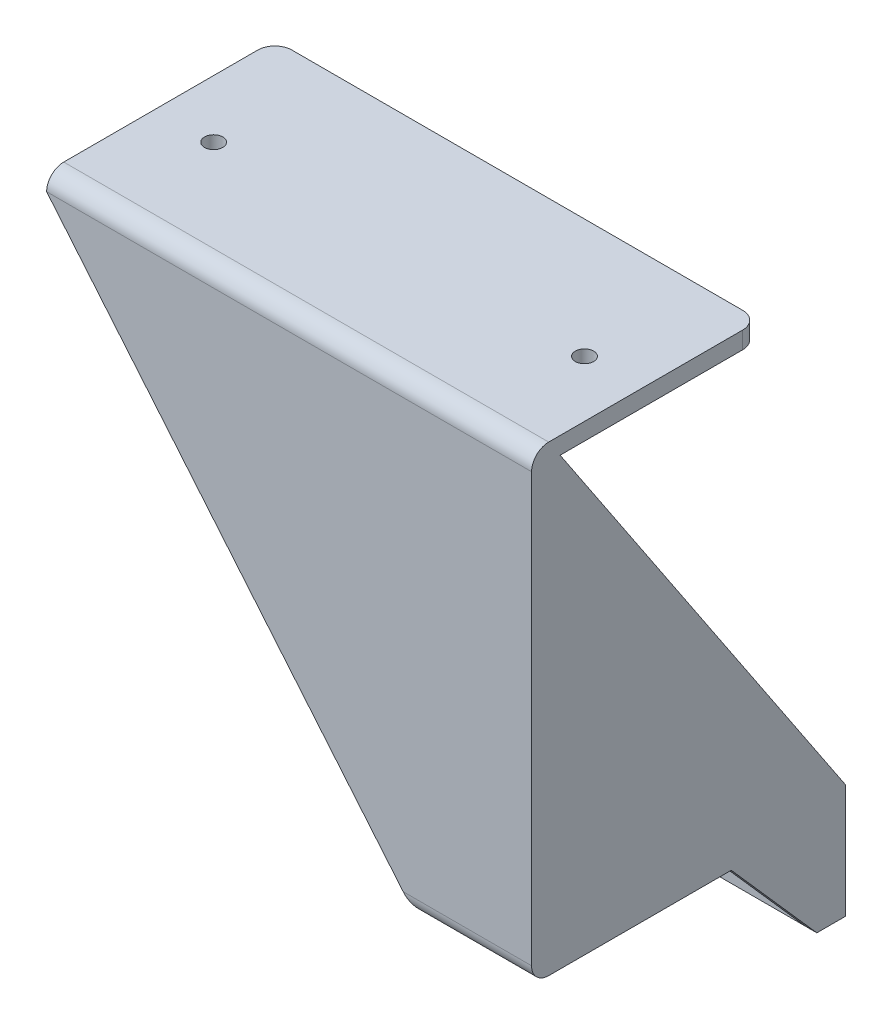
ISO-10303-21;
HEADER;
FILE_DESCRIPTION(('STEP AP214'),'2;1');
FILE_NAME('part.step','',(''),(''),'','','');
FILE_SCHEMA(('AUTOMOTIVE_DESIGN { 1 0 10303 214 1 1 1 1 }'));
ENDSEC;
DATA;
#1=APPLICATION_CONTEXT('core data for automotive mechanical design processes');
#2=APPLICATION_PROTOCOL_DEFINITION('international standard','automotive_design',2000,#1);
#3=PRODUCT_CONTEXT('',#1,'mechanical');
#4=PRODUCT('Part','Part','',(#3));
#5=PRODUCT_RELATED_PRODUCT_CATEGORY('part','',(#4));
#6=PRODUCT_DEFINITION_FORMATION('','',#4);
#7=PRODUCT_DEFINITION_CONTEXT('part definition',#1,'design');
#8=PRODUCT_DEFINITION('design','',#6,#7);
#9=PRODUCT_DEFINITION_SHAPE('','',#8);
#10=(LENGTH_UNIT() NAMED_UNIT(*) SI_UNIT(.MILLI.,.METRE.));
#11=(NAMED_UNIT(*) PLANE_ANGLE_UNIT() SI_UNIT($,.RADIAN.));
#12=(NAMED_UNIT(*) SI_UNIT($,.STERADIAN.) SOLID_ANGLE_UNIT());
#13=UNCERTAINTY_MEASURE_WITH_UNIT(LENGTH_MEASURE(1.E-05),#10,'distance_accuracy_value','');
#14=(GEOMETRIC_REPRESENTATION_CONTEXT(3) GLOBAL_UNCERTAINTY_ASSIGNED_CONTEXT((#13)) GLOBAL_UNIT_ASSIGNED_CONTEXT((#10,
#11,#12)) REPRESENTATION_CONTEXT('',''));
#15=CARTESIAN_POINT('',(0.,0.,0.));
#16=DIRECTION('',(0.,0.,1.));
#17=DIRECTION('',(1.,0.,0.));
#18=AXIS2_PLACEMENT_3D('',#15,#16,#17);
#19=CARTESIAN_POINT('',(-10.,-10.,5.));
#20=DIRECTION('',(1.,0.,0.));
#21=DIRECTION('',(0.,0.,-1.));
#22=AXIS2_PLACEMENT_3D('',#19,#20,#21);
#23=PLANE('',#22);
#24=DIRECTION('',(0.,0.,-1.));
#25=VECTOR('',#24,1.);
#26=CARTESIAN_POINT('',(-10.,7.,25.));
#27=LINE('',#26,#25);
#28=CARTESIAN_POINT('',(-10.,7.,52.));
#29=VERTEX_POINT('',#28);
#30=CARTESIAN_POINT('',(-10.,7.,20.));
#31=VERTEX_POINT('',#30);
#32=EDGE_CURVE('E271',#29,#31,#27,.T.);
#33=ORIENTED_EDGE('',*,*,#32,.F.);
#34=DIRECTION('',(0.,1.,0.));
#35=VECTOR('',#34,1.);
#36=CARTESIAN_POINT('',(-10.,7.,52.));
#37=LINE('',#36,#35);
#38=CARTESIAN_POINT('',(-10.,10.,52.));
#39=VERTEX_POINT('',#38);
#40=EDGE_CURVE('E212',#29,#39,#37,.T.);
#41=ORIENTED_EDGE('',*,*,#40,.T.);
#42=DIRECTION('',(0.,0.,-1.));
#43=VECTOR('',#42,1.);
#44=CARTESIAN_POINT('',(-10.,10.,5.));
#45=LINE('',#44,#43);
#46=CARTESIAN_POINT('',(-10.,10.,0.));
#47=VERTEX_POINT('',#46);
#48=EDGE_CURVE('E321',#39,#47,#45,.T.);
#49=ORIENTED_EDGE('',*,*,#48,.T.);
#50=DIRECTION('',(0.,-1.,0.));
#51=VECTOR('',#50,1.);
#52=CARTESIAN_POINT('',(-10.,-10.,0.));
#53=LINE('',#52,#51);
#54=CARTESIAN_POINT('',(-10.,-10.,0.));
#55=VERTEX_POINT('',#54);
#56=EDGE_CURVE('E415',#47,#55,#53,.T.);
#57=ORIENTED_EDGE('',*,*,#56,.T.);
#58=DIRECTION('',(0.,0.,-1.));
#59=VECTOR('',#58,1.);
#60=CARTESIAN_POINT('',(-10.,-10.,5.));
#61=LINE('',#60,#59);
#62=CARTESIAN_POINT('',(-10.,-10.,5.));
#63=VERTEX_POINT('',#62);
#64=EDGE_CURVE('E428',#63,#55,#61,.T.);
#65=ORIENTED_EDGE('',*,*,#64,.F.);
#66=DIRECTION('',(0.,0.749837855365093,0.661621637086846));
#67=VECTOR('',#66,1.);
#68=CARTESIAN_POINT('',(-10.,7.,20.));
#69=LINE('',#68,#67);
#70=EDGE_CURVE('E296',#63,#31,#69,.T.);
#71=ORIENTED_EDGE('',*,*,#70,.T.);
#72=EDGE_LOOP('',(#33,#41,#49,#57,#65,#71));
#73=FACE_BOUND('',#72,.T.);
#74=ADVANCED_FACE('F51',(#73),#23,.F.);
#75=CARTESIAN_POINT('',(-10.000025,10.,52.));
#76=DIRECTION('',(0.,0.,1.));
#77=DIRECTION('',(0.,-1.,0.));
#78=AXIS2_PLACEMENT_3D('',#75,#76,#77);
#79=PLANE('',#78);
#80=DIRECTION('',(-1.,0.,0.));
#81=VECTOR('',#80,1.);
#82=CARTESIAN_POINT('',(-10.,85.,52.));
#83=LINE('',#82,#81);
#84=CARTESIAN_POINT('',(7.99999999999999,85.,52.));
#85=VERTEX_POINT('',#84);
#86=CARTESIAN_POINT('',(-75.,85.,52.));
#87=VERTEX_POINT('',#86);
#88=EDGE_CURVE('E192',#85,#87,#83,.T.);
#89=ORIENTED_EDGE('',*,*,#88,.F.);
#90=DIRECTION('',(0.,-1.,0.));
#91=VECTOR('',#90,1.);
#92=CARTESIAN_POINT('',(8.,88.,52.));
#93=LINE('',#92,#91);
#94=CARTESIAN_POINT('',(7.99999999999999,10.,52.));
#95=VERTEX_POINT('',#94);
#96=EDGE_CURVE('E245',#85,#95,#93,.T.);
#97=ORIENTED_EDGE('',*,*,#96,.T.);
#98=DIRECTION('',(1.,0.,0.));
#99=VECTOR('',#98,1.);
#100=CARTESIAN_POINT('',(-10.000025,10.,52.));
#101=LINE('',#100,#99);
#102=EDGE_CURVE('E255',#39,#95,#101,.T.);
#103=ORIENTED_EDGE('',*,*,#102,.F.);
#104=ORIENTED_EDGE('',*,*,#40,.F.);
#105=DIRECTION('',(0.64018439966448,-0.768221279597376,0.));
#106=VECTOR('',#105,1.);
#107=CARTESIAN_POINT('',(-75.,85.,52.));
#108=LINE('',#107,#106);
#109=EDGE_CURVE('E206',#87,#29,#108,.T.);
#110=ORIENTED_EDGE('',*,*,#109,.F.);
#111=EDGE_LOOP('',(#89,#97,#103,#104,#110));
#112=FACE_BOUND('',#111,.T.);
#113=ADVANCED_FACE('F214',(#112),#79,.F.);
#114=CARTESIAN_POINT('',(8.,88.,52.));
#115=DIRECTION('',(0.,0.554700196225229,-0.832050294337844));
#116=DIRECTION('',(0.,0.832050294337844,0.554700196225229));
#117=AXIS2_PLACEMENT_3D('',#114,#115,#116);
#118=PLANE('',#117);
#119=DIRECTION('',(0.,0.832050294337844,0.554700196225229));
#120=VECTOR('',#119,1.);
#121=CARTESIAN_POINT('',(8.,88.,52.));
#122=LINE('',#121,#120);
#123=CARTESIAN_POINT('',(8.,10.,0.));
#124=VERTEX_POINT('',#123);
#125=CARTESIAN_POINT('',(8.,85.,50.));
#126=VERTEX_POINT('',#125);
#127=EDGE_CURVE('E251',#124,#126,#122,.T.);
#128=ORIENTED_EDGE('',*,*,#127,.T.);
#129=DIRECTION('',(1.,0.,0.));
#130=VECTOR('',#129,1.);
#131=CARTESIAN_POINT('',(8.,85.,50.));
#132=LINE('',#131,#130);
#133=CARTESIAN_POINT('',(10.,85.,50.));
#134=VERTEX_POINT('',#133);
#135=EDGE_CURVE('E240',#126,#134,#132,.T.);
#136=ORIENTED_EDGE('',*,*,#135,.T.);
#137=DIRECTION('',(0.,0.832050294337844,0.554700196225229));
#138=VECTOR('',#137,1.);
#139=CARTESIAN_POINT('',(10.,88.,52.));
#140=LINE('',#139,#138);
#141=CARTESIAN_POINT('',(10.,10.,0.));
#142=VERTEX_POINT('',#141);
#143=EDGE_CURVE('E244',#142,#134,#140,.T.);
#144=ORIENTED_EDGE('',*,*,#143,.F.);
#145=DIRECTION('',(-1.,0.,0.));
#146=VECTOR('',#145,1.);
#147=CARTESIAN_POINT('',(-10.,10.,0.));
#148=LINE('',#147,#146);
#149=EDGE_CURVE('E411',#142,#124,#148,.T.);
#150=ORIENTED_EDGE('',*,*,#149,.T.);
#151=EDGE_LOOP('',(#128,#136,#144,#150));
#152=FACE_BOUND('',#151,.T.);
#153=ADVANCED_FACE('F396',(#152),#118,.T.);
#154=CARTESIAN_POINT('',(8.,0.,0.));
#155=DIRECTION('',(1.,0.,0.));
#156=DIRECTION('',(0.,0.,-1.));
#157=AXIS2_PLACEMENT_3D('',#154,#155,#156);
#158=PLANE('',#157);
#159=DIRECTION('',(0.,0.,1.));
#160=VECTOR('',#159,1.);
#161=CARTESIAN_POINT('',(8.,85.,0.));
#162=LINE('',#161,#160);
#163=EDGE_CURVE('E196',#126,#85,#162,.T.);
#164=ORIENTED_EDGE('',*,*,#163,.F.);
#165=ORIENTED_EDGE('',*,*,#127,.F.);
#166=DIRECTION('',(0.,0.,-1.));
#167=VECTOR('',#166,1.);
#168=CARTESIAN_POINT('',(8.,10.,52.));
#169=LINE('',#168,#167);
#170=EDGE_CURVE('E248',#95,#124,#169,.T.);
#171=ORIENTED_EDGE('',*,*,#170,.F.);
#172=ORIENTED_EDGE('',*,*,#96,.F.);
#173=EDGE_LOOP('',(#164,#165,#171,#172));
#174=FACE_BOUND('',#173,.T.);
#175=ADVANCED_FACE('F566',(#174),#158,.F.);
#176=CARTESIAN_POINT('',(-10.,10.,5.));
#177=DIRECTION('',(0.,-1.,0.));
#178=DIRECTION('',(0.,0.,-1.));
#179=AXIS2_PLACEMENT_3D('',#176,#177,#178);
#180=PLANE('',#179);
#181=ORIENTED_EDGE('',*,*,#170,.T.);
#182=EDGE_CURVE('E408',#124,#47,#148,.T.);
#183=ORIENTED_EDGE('',*,*,#182,.T.);
#184=ORIENTED_EDGE('',*,*,#48,.F.);
#185=ORIENTED_EDGE('',*,*,#102,.T.);
#186=EDGE_LOOP('',(#181,#183,#184,#185));
#187=FACE_BOUND('',#186,.T.);
#188=ADVANCED_FACE('F563',(#187),#180,.F.);
#189=CARTESIAN_POINT('',(0.,0.,5.));
#190=DIRECTION('',(0.,0.,-1.));
#191=DIRECTION('',(-1.,0.,0.));
#192=AXIS2_PLACEMENT_3D('',#189,#190,#191);
#193=PLANE('',#192);
#194=CARTESIAN_POINT('',(0.,-1.5,5.));
#195=DIRECTION('',(0.,0.,1.));
#196=DIRECTION('',(1.,0.,0.));
#197=AXIS2_PLACEMENT_3D('',#194,#195,#196);
#198=CIRCLE('',#197,2.6);
#199=CARTESIAN_POINT('',(2.6,-1.5,5.));
#200=VERTEX_POINT('',#199);
#201=EDGE_CURVE('E274',#200,#200,#198,.T.);
#202=ORIENTED_EDGE('',*,*,#201,.F.);
#203=EDGE_LOOP('',(#202));
#204=FACE_BOUND('',#203,.T.);
#205=DIRECTION('',(1.,0.,0.));
#206=VECTOR('',#205,1.);
#207=CARTESIAN_POINT('',(-10.,-10.,5.));
#208=LINE('',#207,#206);
#209=CARTESIAN_POINT('',(-8.,-10.,5.));
#210=VERTEX_POINT('',#209);
#211=CARTESIAN_POINT('',(8.,-10.,5.));
#212=VERTEX_POINT('',#211);
#213=EDGE_CURVE('E425',#210,#212,#208,.T.);
#214=ORIENTED_EDGE('',*,*,#213,.T.);
#215=DIRECTION('',(0.,1.,0.));
#216=VECTOR('',#215,1.);
#217=CARTESIAN_POINT('',(8.,-10.,5.));
#218=LINE('',#217,#216);
#219=CARTESIAN_POINT('',(8.,7.,5.));
#220=VERTEX_POINT('',#219);
#221=EDGE_CURVE('E283',#212,#220,#218,.T.);
#222=ORIENTED_EDGE('',*,*,#221,.T.);
#223=DIRECTION('',(1.,0.,0.));
#224=VECTOR('',#223,1.);
#225=CARTESIAN_POINT('',(0.,7.,5.));
#226=LINE('',#225,#224);
#227=CARTESIAN_POINT('',(-8.,7.,5.));
#228=VERTEX_POINT('',#227);
#229=EDGE_CURVE('E308',#228,#220,#226,.T.);
#230=ORIENTED_EDGE('',*,*,#229,.F.);
#231=DIRECTION('',(0.,-1.,0.));
#232=VECTOR('',#231,1.);
#233=CARTESIAN_POINT('',(-8.,-10.,5.));
#234=LINE('',#233,#232);
#235=EDGE_CURVE('E297',#228,#210,#234,.T.);
#236=ORIENTED_EDGE('',*,*,#235,.T.);
#237=EDGE_LOOP('',(#214,#222,#230,#236));
#238=FACE_BOUND('',#237,.T.);
#239=ADVANCED_FACE('F466',(#204,#238),#193,.F.);
#240=CARTESIAN_POINT('',(-10.,7.,20.));
#241=DIRECTION('',(0.,1.,0.));
#242=DIRECTION('',(0.,0.,1.));
#243=AXIS2_PLACEMENT_3D('',#240,#241,#242);
#244=PLANE('',#243);
#245=DIRECTION('',(0.,0.,-1.));
#246=VECTOR('',#245,1.);
#247=CARTESIAN_POINT('',(10.,7.,25.));
#248=LINE('',#247,#246);
#249=CARTESIAN_POINT('',(10.,7.,52.));
#250=VERTEX_POINT('',#249);
#251=CARTESIAN_POINT('',(10.,7.,20.));
#252=VERTEX_POINT('',#251);
#253=EDGE_CURVE('E268',#250,#252,#248,.T.);
#254=ORIENTED_EDGE('',*,*,#253,.F.);
#255=DIRECTION('',(1.,0.,0.));
#256=VECTOR('',#255,1.);
#257=CARTESIAN_POINT('',(-10.,7.,52.));
#258=LINE('',#257,#256);
#259=EDGE_CURVE('E366',#250,#29,#258,.F.);
#260=ORIENTED_EDGE('',*,*,#259,.T.);
#261=ORIENTED_EDGE('',*,*,#32,.T.);
#262=DIRECTION('',(1.,0.,0.));
#263=VECTOR('',#262,1.);
#264=CARTESIAN_POINT('',(-10.,7.,20.));
#265=LINE('',#264,#263);
#266=CARTESIAN_POINT('',(-8.,7.,20.));
#267=VERTEX_POINT('',#266);
#268=EDGE_CURVE('E311',#31,#267,#265,.T.);
#269=ORIENTED_EDGE('',*,*,#268,.T.);
#270=DIRECTION('',(0.,0.,-1.));
#271=VECTOR('',#270,1.);
#272=CARTESIAN_POINT('',(-8.,7.,5.));
#273=LINE('',#272,#271);
#274=EDGE_CURVE('E302',#267,#228,#273,.T.);
#275=ORIENTED_EDGE('',*,*,#274,.T.);
#276=ORIENTED_EDGE('',*,*,#229,.T.);
#277=DIRECTION('',(0.,0.,1.));
#278=VECTOR('',#277,1.);
#279=CARTESIAN_POINT('',(8.,7.,5.));
#280=LINE('',#279,#278);
#281=CARTESIAN_POINT('',(8.,7.,20.));
#282=VERTEX_POINT('',#281);
#283=EDGE_CURVE('E292',#220,#282,#280,.T.);
#284=ORIENTED_EDGE('',*,*,#283,.T.);
#285=DIRECTION('',(1.,0.,0.));
#286=VECTOR('',#285,1.);
#287=CARTESIAN_POINT('',(8.,7.,20.));
#288=LINE('',#287,#286);
#289=EDGE_CURVE('E287',#282,#252,#288,.T.);
#290=ORIENTED_EDGE('',*,*,#289,.T.);
#291=EDGE_LOOP('',(#254,#260,#261,#269,#275,#276,#284,#290));
#292=FACE_BOUND('',#291,.T.);
#293=ADVANCED_FACE('F460',(#292),#244,.F.);
#294=CARTESIAN_POINT('',(10.,-10.,5.));
#295=DIRECTION('',(-1.,0.,0.));
#296=DIRECTION('',(0.,0.,1.));
#297=AXIS2_PLACEMENT_3D('',#294,#295,#296);
#298=PLANE('',#297);
#299=DIRECTION('',(0.,-1.,0.));
#300=VECTOR('',#299,1.);
#301=CARTESIAN_POINT('',(10.,10.,55.));
#302=LINE('',#301,#300);
#303=CARTESIAN_POINT('',(10.,85.,55.));
#304=VERTEX_POINT('',#303);
#305=CARTESIAN_POINT('',(10.,10.,55.));
#306=VERTEX_POINT('',#305);
#307=EDGE_CURVE('E265',#304,#306,#302,.T.);
#308=ORIENTED_EDGE('',*,*,#307,.T.);
#309=CARTESIAN_POINT('',(10.,10.,52.));
#310=DIRECTION('',(-1.,0.,0.));
#311=DIRECTION('',(0.,0.,1.));
#312=AXIS2_PLACEMENT_3D('',#309,#310,#311);
#313=CIRCLE('',#312,3.);
#314=EDGE_CURVE('E73',#306,#250,#313,.F.);
#315=ORIENTED_EDGE('',*,*,#314,.T.);
#316=ORIENTED_EDGE('',*,*,#253,.T.);
#317=DIRECTION('',(0.,-0.749837855365093,-0.661621637086846));
#318=VECTOR('',#317,1.);
#319=CARTESIAN_POINT('',(10.,7.,20.));
#320=LINE('',#319,#318);
#321=CARTESIAN_POINT('',(10.,-10.,5.));
#322=VERTEX_POINT('',#321);
#323=EDGE_CURVE('E279',#252,#322,#320,.T.);
#324=ORIENTED_EDGE('',*,*,#323,.T.);
#325=DIRECTION('',(0.,0.,-1.));
#326=VECTOR('',#325,1.);
#327=CARTESIAN_POINT('',(10.,-10.,5.));
#328=LINE('',#327,#326);
#329=CARTESIAN_POINT('',(10.,-10.,0.));
#330=VERTEX_POINT('',#329);
#331=EDGE_CURVE('E404',#322,#330,#328,.T.);
#332=ORIENTED_EDGE('',*,*,#331,.T.);
#333=DIRECTION('',(0.,1.,0.));
#334=VECTOR('',#333,1.);
#335=CARTESIAN_POINT('',(10.,-10.,0.));
#336=LINE('',#335,#334);
#337=EDGE_CURVE('E401',#330,#142,#336,.T.);
#338=ORIENTED_EDGE('',*,*,#337,.T.);
#339=ORIENTED_EDGE('',*,*,#143,.T.);
#340=DIRECTION('',(0.,0.,1.));
#341=VECTOR('',#340,1.);
#342=CARTESIAN_POINT('',(10.,85.,9.99999999999997));
#343=LINE('',#342,#341);
#344=CARTESIAN_POINT('',(10.,85.,18.));
#345=VERTEX_POINT('',#344);
#346=EDGE_CURVE('E200',#345,#134,#343,.T.);
#347=ORIENTED_EDGE('',*,*,#346,.F.);
#348=DIRECTION('',(0.,1.,0.));
#349=VECTOR('',#348,1.);
#350=CARTESIAN_POINT('',(10.,-10.,18.));
#351=LINE('',#350,#349);
#352=CARTESIAN_POINT('',(10.,88.,18.));
#353=VERTEX_POINT('',#352);
#354=EDGE_CURVE('E320',#345,#353,#351,.T.);
#355=ORIENTED_EDGE('',*,*,#354,.T.);
#356=DIRECTION('',(0.,0.,1.));
#357=VECTOR('',#356,1.);
#358=CARTESIAN_POINT('',(10.,88.,55.));
#359=LINE('',#358,#357);
#360=CARTESIAN_POINT('',(10.,88.,52.));
#361=VERTEX_POINT('',#360);
#362=EDGE_CURVE('E261',#353,#361,#359,.T.);
#363=ORIENTED_EDGE('',*,*,#362,.T.);
#364=CARTESIAN_POINT('',(10.,85.,52.));
#365=DIRECTION('',(-1.,0.,0.));
#366=DIRECTION('',(0.,0.,1.));
#367=AXIS2_PLACEMENT_3D('',#364,#365,#366);
#368=CIRCLE('',#367,3.);
#369=EDGE_CURVE('E361',#361,#304,#368,.F.);
#370=ORIENTED_EDGE('',*,*,#369,.T.);
#371=EDGE_LOOP('',(#308,#315,#316,#324,#332,#338,#339,#347,#355,#363,#370));
#372=FACE_BOUND('',#371,.T.);
#373=ADVANCED_FACE('F379',(#372),#298,.F.);
#374=CARTESIAN_POINT('',(-10.,-10.,5.));
#375=DIRECTION('',(0.,1.,0.));
#376=DIRECTION('',(-1.,0.,0.));
#377=AXIS2_PLACEMENT_3D('',#374,#375,#376);
#378=PLANE('',#377);
#379=DIRECTION('',(1.,0.,0.));
#380=VECTOR('',#379,1.);
#381=CARTESIAN_POINT('',(-10.,-10.,0.));
#382=LINE('',#381,#380);
#383=EDGE_CURVE('E420',#55,#330,#382,.T.);
#384=ORIENTED_EDGE('',*,*,#383,.T.);
#385=ORIENTED_EDGE('',*,*,#331,.F.);
#386=DIRECTION('',(1.,0.,0.));
#387=VECTOR('',#386,1.);
#388=CARTESIAN_POINT('',(8.,-10.,5.));
#389=LINE('',#388,#387);
#390=EDGE_CURVE('E293',#212,#322,#389,.T.);
#391=ORIENTED_EDGE('',*,*,#390,.F.);
#392=ORIENTED_EDGE('',*,*,#213,.F.);
#393=EDGE_CURVE('E429',#63,#210,#208,.T.);
#394=ORIENTED_EDGE('',*,*,#393,.F.);
#395=ORIENTED_EDGE('',*,*,#64,.T.);
#396=EDGE_LOOP('',(#384,#385,#391,#392,#394,#395));
#397=FACE_BOUND('',#396,.T.);
#398=ADVANCED_FACE('F561',(#397),#378,.F.);
#399=CARTESIAN_POINT('',(0.,0.,0.));
#400=DIRECTION('',(0.,0.,-1.));
#401=DIRECTION('',(-1.,0.,0.));
#402=AXIS2_PLACEMENT_3D('',#399,#400,#401);
#403=PLANE('',#402);
#404=CARTESIAN_POINT('',(0.,-1.5,0.));
#405=DIRECTION('',(0.,0.,1.));
#406=DIRECTION('',(1.,0.,0.));
#407=AXIS2_PLACEMENT_3D('',#404,#405,#406);
#408=CIRCLE('',#407,2.6);
#409=CARTESIAN_POINT('',(2.6,-1.5,0.));
#410=VERTEX_POINT('',#409);
#411=EDGE_CURVE('E275',#410,#410,#408,.T.);
#412=ORIENTED_EDGE('',*,*,#411,.T.);
#413=EDGE_LOOP('',(#412));
#414=FACE_BOUND('',#413,.T.);
#415=ORIENTED_EDGE('',*,*,#149,.F.);
#416=ORIENTED_EDGE('',*,*,#337,.F.);
#417=ORIENTED_EDGE('',*,*,#383,.F.);
#418=ORIENTED_EDGE('',*,*,#56,.F.);
#419=ORIENTED_EDGE('',*,*,#182,.F.);
#420=EDGE_LOOP('',(#415,#416,#417,#418,#419));
#421=FACE_BOUND('',#420,.T.);
#422=ADVANCED_FACE('F412',(#414,#421),#403,.T.);
#423=CARTESIAN_POINT('',(-8.,7.,20.));
#424=DIRECTION('',(0.,-0.661621637086846,0.749837855365093));
#425=DIRECTION('',(0.,-0.749837855365093,-0.661621637086846));
#426=AXIS2_PLACEMENT_3D('',#423,#424,#425);
#427=PLANE('',#426);
#428=ORIENTED_EDGE('',*,*,#70,.F.);
#429=ORIENTED_EDGE('',*,*,#393,.T.);
#430=DIRECTION('',(0.,0.749837855365093,0.661621637086846));
#431=VECTOR('',#430,1.);
#432=CARTESIAN_POINT('',(-8.,7.,20.));
#433=LINE('',#432,#431);
#434=EDGE_CURVE('E301',#210,#267,#433,.T.);
#435=ORIENTED_EDGE('',*,*,#434,.T.);
#436=ORIENTED_EDGE('',*,*,#268,.F.);
#437=EDGE_LOOP('',(#428,#429,#435,#436));
#438=FACE_BOUND('',#437,.T.);
#439=ADVANCED_FACE('F539',(#438),#427,.T.);
#440=CARTESIAN_POINT('',(-8.,0.,0.));
#441=DIRECTION('',(-1.,0.,0.));
#442=DIRECTION('',(0.,0.,1.));
#443=AXIS2_PLACEMENT_3D('',#440,#441,#442);
#444=PLANE('',#443);
#445=ORIENTED_EDGE('',*,*,#274,.F.);
#446=ORIENTED_EDGE('',*,*,#434,.F.);
#447=ORIENTED_EDGE('',*,*,#235,.F.);
#448=EDGE_LOOP('',(#445,#446,#447));
#449=FACE_BOUND('',#448,.T.);
#450=ADVANCED_FACE('F542',(#449),#444,.F.);
#451=CARTESIAN_POINT('',(8.,7.,20.));
#452=DIRECTION('',(0.,-0.661621637086846,0.749837855365093));
#453=DIRECTION('',(0.,-0.749837855365093,-0.661621637086846));
#454=AXIS2_PLACEMENT_3D('',#451,#452,#453);
#455=PLANE('',#454);
#456=ORIENTED_EDGE('',*,*,#323,.F.);
#457=ORIENTED_EDGE('',*,*,#289,.F.);
#458=DIRECTION('',(0.,-0.749837855365093,-0.661621637086846));
#459=VECTOR('',#458,1.);
#460=CARTESIAN_POINT('',(8.,7.,20.));
#461=LINE('',#460,#459);
#462=EDGE_CURVE('E288',#282,#212,#461,.T.);
#463=ORIENTED_EDGE('',*,*,#462,.T.);
#464=ORIENTED_EDGE('',*,*,#390,.T.);
#465=EDGE_LOOP('',(#456,#457,#463,#464));
#466=FACE_BOUND('',#465,.T.);
#467=ADVANCED_FACE('F544',(#466),#455,.T.);
#468=CARTESIAN_POINT('',(8.,0.,0.));
#469=DIRECTION('',(-1.,0.,0.));
#470=DIRECTION('',(0.,0.,1.));
#471=AXIS2_PLACEMENT_3D('',#468,#469,#470);
#472=PLANE('',#471);
#473=ORIENTED_EDGE('',*,*,#283,.F.);
#474=ORIENTED_EDGE('',*,*,#221,.F.);
#475=ORIENTED_EDGE('',*,*,#462,.F.);
#476=EDGE_LOOP('',(#473,#474,#475));
#477=FACE_BOUND('',#476,.T.);
#478=ADVANCED_FACE('F549',(#477),#472,.T.);
#479=CARTESIAN_POINT('',(0.,-1.5,0.));
#480=DIRECTION('',(0.,0.,1.));
#481=DIRECTION('',(1.,0.,0.));
#482=AXIS2_PLACEMENT_3D('',#479,#480,#481);
#483=CYLINDRICAL_SURFACE('',#482,2.6);
#484=ORIENTED_EDGE('',*,*,#411,.F.);
#485=EDGE_LOOP('',(#484));
#486=FACE_BOUND('',#485,.T.);
#487=ORIENTED_EDGE('',*,*,#201,.T.);
#488=EDGE_LOOP('',(#487));
#489=FACE_BOUND('',#488,.T.);
#490=ADVANCED_FACE('F586',(#486,#489),#483,.F.);
#491=CARTESIAN_POINT('',(-10.,10.,55.));
#492=DIRECTION('',(0.,0.,1.));
#493=DIRECTION('',(1.,0.,0.));
#494=AXIS2_PLACEMENT_3D('',#491,#492,#493);
#495=PLANE('',#494);
#496=DIRECTION('',(0.64018439966448,-0.768221279597376,0.));
#497=VECTOR('',#496,1.);
#498=CARTESIAN_POINT('',(-75.,85.,55.));
#499=LINE('',#498,#497);
#500=CARTESIAN_POINT('',(-75.,85.,55.));
#501=VERTEX_POINT('',#500);
#502=CARTESIAN_POINT('',(-12.5,10.,55.));
#503=VERTEX_POINT('',#502);
#504=EDGE_CURVE('E209',#501,#503,#499,.T.);
#505=ORIENTED_EDGE('',*,*,#504,.T.);
#506=DIRECTION('',(1.,0.,0.));
#507=VECTOR('',#506,1.);
#508=CARTESIAN_POINT('',(10.,10.,55.));
#509=LINE('',#508,#507);
#510=EDGE_CURVE('E357',#503,#306,#509,.T.);
#511=ORIENTED_EDGE('',*,*,#510,.T.);
#512=ORIENTED_EDGE('',*,*,#307,.F.);
#513=DIRECTION('',(1.,0.,0.));
#514=VECTOR('',#513,1.);
#515=CARTESIAN_POINT('',(-10.,85.,55.));
#516=LINE('',#515,#514);
#517=EDGE_CURVE('E354',#304,#501,#516,.F.);
#518=ORIENTED_EDGE('',*,*,#517,.T.);
#519=EDGE_LOOP('',(#505,#511,#512,#518));
#520=FACE_BOUND('',#519,.T.);
#521=ADVANCED_FACE('F583',(#520),#495,.T.);
#522=CARTESIAN_POINT('',(-10.,88.,55.));
#523=DIRECTION('',(0.,1.,0.));
#524=DIRECTION('',(0.,0.,1.));
#525=AXIS2_PLACEMENT_3D('',#522,#523,#524);
#526=PLANE('',#525);
#527=CARTESIAN_POINT('',(0.120495814255092,88.,35.8461981036506));
#528=DIRECTION('',(0.,1.,0.));
#529=DIRECTION('',(0.,0.,1.));
#530=AXIS2_PLACEMENT_3D('',#527,#528,#529);
#531=CIRCLE('',#530,1.59999999999999);
#532=CARTESIAN_POINT('',(0.120495814255092,88.,37.4461981036506));
#533=VERTEX_POINT('',#532);
#534=EDGE_CURVE('E326',#533,#533,#531,.T.);
#535=ORIENTED_EDGE('',*,*,#534,.F.);
#536=EDGE_LOOP('',(#535));
#537=FACE_BOUND('',#536,.T.);
#538=CARTESIAN_POINT('',(-64.8795041857451,88.,35.8461981036508));
#539=DIRECTION('',(0.,1.,0.));
#540=DIRECTION('',(0.,0.,1.));
#541=AXIS2_PLACEMENT_3D('',#538,#539,#540);
#542=CIRCLE('',#541,1.59999999999999);
#543=CARTESIAN_POINT('',(-64.8795041857451,88.,37.4461981036508));
#544=VERTEX_POINT('',#543);
#545=EDGE_CURVE('E228',#544,#544,#542,.T.);
#546=ORIENTED_EDGE('',*,*,#545,.F.);
#547=EDGE_LOOP('',(#546));
#548=FACE_BOUND('',#547,.T.);
#549=DIRECTION('',(0.,0.,-1.));
#550=VECTOR('',#549,1.);
#551=CARTESIAN_POINT('',(-75.,88.,9.99999999999997));
#552=LINE('',#551,#550);
#553=CARTESIAN_POINT('',(-75.,88.,52.));
#554=VERTEX_POINT('',#553);
#555=CARTESIAN_POINT('',(-75.,88.,18.));
#556=VERTEX_POINT('',#555);
#557=EDGE_CURVE('E187',#554,#556,#552,.T.);
#558=ORIENTED_EDGE('',*,*,#557,.F.);
#559=DIRECTION('',(1.,0.,0.));
#560=VECTOR('',#559,1.);
#561=CARTESIAN_POINT('',(-10.,88.,52.));
#562=LINE('',#561,#560);
#563=EDGE_CURVE('E60',#554,#361,#562,.T.);
#564=ORIENTED_EDGE('',*,*,#563,.T.);
#565=ORIENTED_EDGE('',*,*,#362,.F.);
#566=CARTESIAN_POINT('',(7.,88.,18.));
#567=DIRECTION('',(0.,1.,0.));
#568=DIRECTION('',(0.,0.,1.));
#569=AXIS2_PLACEMENT_3D('',#566,#567,#568);
#570=CIRCLE('',#569,3.);
#571=CARTESIAN_POINT('',(6.99999999999999,88.,15.));
#572=VERTEX_POINT('',#571);
#573=EDGE_CURVE('E337',#353,#572,#570,.T.);
#574=ORIENTED_EDGE('',*,*,#573,.T.);
#575=DIRECTION('',(1.,0.,0.));
#576=VECTOR('',#575,1.);
#577=CARTESIAN_POINT('',(-75.,88.,15.));
#578=LINE('',#577,#576);
#579=CARTESIAN_POINT('',(-72.,88.,15.));
#580=VERTEX_POINT('',#579);
#581=EDGE_CURVE('E211',#580,#572,#578,.T.);
#582=ORIENTED_EDGE('',*,*,#581,.F.);
#583=CARTESIAN_POINT('',(-72.,88.,18.));
#584=DIRECTION('',(0.,1.,0.));
#585=DIRECTION('',(0.,0.,1.));
#586=AXIS2_PLACEMENT_3D('',#583,#584,#585);
#587=CIRCLE('',#586,3.);
#588=EDGE_CURVE('E333',#580,#556,#587,.T.);
#589=ORIENTED_EDGE('',*,*,#588,.T.);
#590=EDGE_LOOP('',(#558,#564,#565,#574,#582,#589));
#591=FACE_BOUND('',#590,.T.);
#592=ADVANCED_FACE('F377',(#537,#548,#591),#526,.T.);
#593=CARTESIAN_POINT('',(-10.,85.,9.99999999999997));
#594=DIRECTION('',(0.,1.,0.));
#595=DIRECTION('',(0.,0.,1.));
#596=AXIS2_PLACEMENT_3D('',#593,#594,#595);
#597=PLANE('',#596);
#598=CARTESIAN_POINT('',(0.120495814255092,85.,35.8461981036506));
#599=DIRECTION('',(0.,1.,0.));
#600=DIRECTION('',(0.,0.,1.));
#601=AXIS2_PLACEMENT_3D('',#598,#599,#600);
#602=CIRCLE('',#601,1.59999999999999);
#603=CARTESIAN_POINT('',(0.120495814255092,85.,37.4461981036506));
#604=VERTEX_POINT('',#603);
#605=EDGE_CURVE('E225',#604,#604,#602,.T.);
#606=ORIENTED_EDGE('',*,*,#605,.T.);
#607=EDGE_LOOP('',(#606));
#608=FACE_BOUND('',#607,.T.);
#609=CARTESIAN_POINT('',(-64.8795041857451,85.,35.8461981036508));
#610=DIRECTION('',(0.,1.,0.));
#611=DIRECTION('',(0.,0.,1.));
#612=AXIS2_PLACEMENT_3D('',#609,#610,#611);
#613=CIRCLE('',#612,1.59999999999999);
#614=CARTESIAN_POINT('',(-64.8795041857451,85.,37.4461981036508));
#615=VERTEX_POINT('',#614);
#616=EDGE_CURVE('E322',#615,#615,#613,.T.);
#617=ORIENTED_EDGE('',*,*,#616,.T.);
#618=EDGE_LOOP('',(#617));
#619=FACE_BOUND('',#618,.T.);
#620=DIRECTION('',(1.,0.,0.));
#621=VECTOR('',#620,1.);
#622=CARTESIAN_POINT('',(-10.,85.,15.));
#623=LINE('',#622,#621);
#624=CARTESIAN_POINT('',(-72.,85.,15.));
#625=VERTEX_POINT('',#624);
#626=CARTESIAN_POINT('',(7.,85.,15.));
#627=VERTEX_POINT('',#626);
#628=EDGE_CURVE('E188',#625,#627,#623,.T.);
#629=ORIENTED_EDGE('',*,*,#628,.T.);
#630=CARTESIAN_POINT('',(7.,85.,18.));
#631=DIRECTION('',(0.,1.,0.));
#632=DIRECTION('',(0.,0.,1.));
#633=AXIS2_PLACEMENT_3D('',#630,#631,#632);
#634=CIRCLE('',#633,3.);
#635=EDGE_CURVE('E349',#627,#345,#634,.F.);
#636=ORIENTED_EDGE('',*,*,#635,.T.);
#637=ORIENTED_EDGE('',*,*,#346,.T.);
#638=ORIENTED_EDGE('',*,*,#135,.F.);
#639=ORIENTED_EDGE('',*,*,#163,.T.);
#640=ORIENTED_EDGE('',*,*,#88,.T.);
#641=DIRECTION('',(0.,0.,1.));
#642=VECTOR('',#641,1.);
#643=CARTESIAN_POINT('',(-75.,85.,9.99999999999997));
#644=LINE('',#643,#642);
#645=CARTESIAN_POINT('',(-75.,85.,18.));
#646=VERTEX_POINT('',#645);
#647=EDGE_CURVE('E177',#646,#87,#644,.T.);
#648=ORIENTED_EDGE('',*,*,#647,.F.);
#649=CARTESIAN_POINT('',(-72.,85.,18.));
#650=DIRECTION('',(0.,1.,0.));
#651=DIRECTION('',(0.,0.,1.));
#652=AXIS2_PLACEMENT_3D('',#649,#650,#651);
#653=CIRCLE('',#652,3.);
#654=EDGE_CURVE('E346',#646,#625,#653,.F.);
#655=ORIENTED_EDGE('',*,*,#654,.T.);
#656=EDGE_LOOP('',(#629,#636,#637,#638,#639,#640,#648,#655));
#657=FACE_BOUND('',#656,.T.);
#658=ADVANCED_FACE('F194',(#608,#619,#657),#597,.F.);
#659=CARTESIAN_POINT('',(-75.,0.,0.));
#660=DIRECTION('',(-1.,0.,0.));
#661=DIRECTION('',(0.,0.,1.));
#662=AXIS2_PLACEMENT_3D('',#659,#660,#661);
#663=PLANE('',#662);
#664=DIRECTION('',(0.,0.,1.));
#665=VECTOR('',#664,1.);
#666=CARTESIAN_POINT('',(-75.,85.,52.));
#667=LINE('',#666,#665);
#668=EDGE_CURVE('E181',#87,#501,#667,.T.);
#669=ORIENTED_EDGE('',*,*,#668,.T.);
#670=CARTESIAN_POINT('',(-75.,85.,52.));
#671=DIRECTION('',(-1.,0.,0.));
#672=DIRECTION('',(0.,0.,1.));
#673=AXIS2_PLACEMENT_3D('',#670,#671,#672);
#674=CIRCLE('',#673,3.);
#675=EDGE_CURVE('E11',#501,#554,#674,.T.);
#676=ORIENTED_EDGE('',*,*,#675,.T.);
#677=ORIENTED_EDGE('',*,*,#557,.T.);
#678=DIRECTION('',(0.,1.,0.));
#679=VECTOR('',#678,1.);
#680=CARTESIAN_POINT('',(-75.,85.,18.));
#681=LINE('',#680,#679);
#682=EDGE_CURVE('E183',#556,#646,#681,.F.);
#683=ORIENTED_EDGE('',*,*,#682,.T.);
#684=ORIENTED_EDGE('',*,*,#647,.T.);
#685=EDGE_LOOP('',(#669,#676,#677,#683,#684));
#686=FACE_BOUND('',#685,.T.);
#687=ADVANCED_FACE('F179',(#686),#663,.T.);
#688=CARTESIAN_POINT('',(-75.,60.,15.));
#689=DIRECTION('',(0.,0.,1.));
#690=DIRECTION('',(1.,0.,0.));
#691=AXIS2_PLACEMENT_3D('',#688,#689,#690);
#692=PLANE('',#691);
#693=ORIENTED_EDGE('',*,*,#581,.T.);
#694=DIRECTION('',(0.,1.,0.));
#695=VECTOR('',#694,1.);
#696=CARTESIAN_POINT('',(6.99999999999999,60.,15.));
#697=LINE('',#696,#695);
#698=EDGE_CURVE('E343',#572,#627,#697,.F.);
#699=ORIENTED_EDGE('',*,*,#698,.T.);
#700=ORIENTED_EDGE('',*,*,#628,.F.);
#701=DIRECTION('',(0.,1.,0.));
#702=VECTOR('',#701,1.);
#703=CARTESIAN_POINT('',(-72.,88.,15.));
#704=LINE('',#703,#702);
#705=EDGE_CURVE('E339',#625,#580,#704,.T.);
#706=ORIENTED_EDGE('',*,*,#705,.T.);
#707=EDGE_LOOP('',(#693,#699,#700,#706));
#708=FACE_BOUND('',#707,.T.);
#709=ADVANCED_FACE('F389',(#708),#692,.F.);
#710=CARTESIAN_POINT('',(-75.,85.,52.));
#711=DIRECTION('',(-0.768221279597376,-0.64018439966448,0.));
#712=DIRECTION('',(0.64018439966448,-0.768221279597376,0.));
#713=AXIS2_PLACEMENT_3D('',#710,#711,#712);
#714=PLANE('',#713);
#715=ORIENTED_EDGE('',*,*,#109,.T.);
#716=CARTESIAN_POINT('',(-12.5,10.,52.));
#717=DIRECTION('',(-0.768221279597376,-0.64018439966448,0.));
#718=DIRECTION('',(-0.64018439966448,0.768221279597376,0.));
#719=AXIS2_PLACEMENT_3D('',#716,#717,#718);
#720=ELLIPSE('',#719,3.90512483795333,3.);
#721=EDGE_CURVE('E369',#29,#503,#720,.T.);
#722=ORIENTED_EDGE('',*,*,#721,.T.);
#723=ORIENTED_EDGE('',*,*,#504,.F.);
#724=ORIENTED_EDGE('',*,*,#668,.F.);
#725=EDGE_LOOP('',(#715,#722,#723,#724));
#726=FACE_BOUND('',#725,.T.);
#727=ADVANCED_FACE('F205',(#726),#714,.T.);
#728=CARTESIAN_POINT('',(-64.8795041857451,81.,35.8461981036508));
#729=DIRECTION('',(0.,1.,0.));
#730=DIRECTION('',(0.,0.,1.));
#731=AXIS2_PLACEMENT_3D('',#728,#729,#730);
#732=CYLINDRICAL_SURFACE('',#731,1.59999999999999);
#733=ORIENTED_EDGE('',*,*,#545,.T.);
#734=EDGE_LOOP('',(#733));
#735=FACE_BOUND('',#734,.T.);
#736=ORIENTED_EDGE('',*,*,#616,.F.);
#737=EDGE_LOOP('',(#736));
#738=FACE_BOUND('',#737,.T.);
#739=ADVANCED_FACE('F620',(#735,#738),#732,.F.);
#740=CARTESIAN_POINT('',(0.120495814255092,81.,35.8461981036506));
#741=DIRECTION('',(0.,1.,0.));
#742=DIRECTION('',(0.,0.,1.));
#743=AXIS2_PLACEMENT_3D('',#740,#741,#742);
#744=CYLINDRICAL_SURFACE('',#743,1.59999999999999);
#745=ORIENTED_EDGE('',*,*,#534,.T.);
#746=EDGE_LOOP('',(#745));
#747=FACE_BOUND('',#746,.T.);
#748=ORIENTED_EDGE('',*,*,#605,.F.);
#749=EDGE_LOOP('',(#748));
#750=FACE_BOUND('',#749,.T.);
#751=ADVANCED_FACE('F572',(#747,#750),#744,.F.);
#752=CARTESIAN_POINT('',(7.,-10.,18.));
#753=DIRECTION('',(0.,1.,0.));
#754=DIRECTION('',(0.,0.,1.));
#755=AXIS2_PLACEMENT_3D('',#752,#753,#754);
#756=CYLINDRICAL_SURFACE('',#755,3.);
#757=ORIENTED_EDGE('',*,*,#635,.F.);
#758=ORIENTED_EDGE('',*,*,#698,.F.);
#759=ORIENTED_EDGE('',*,*,#573,.F.);
#760=ORIENTED_EDGE('',*,*,#354,.F.);
#761=EDGE_LOOP('',(#757,#758,#759,#760));
#762=FACE_BOUND('',#761,.T.);
#763=ADVANCED_FACE('F385',(#762),#756,.T.);
#764=CARTESIAN_POINT('',(-72.,60.,18.));
#765=DIRECTION('',(0.,-1.,0.));
#766=DIRECTION('',(0.,0.,-1.));
#767=AXIS2_PLACEMENT_3D('',#764,#765,#766);
#768=CYLINDRICAL_SURFACE('',#767,3.);
#769=ORIENTED_EDGE('',*,*,#654,.F.);
#770=ORIENTED_EDGE('',*,*,#682,.F.);
#771=ORIENTED_EDGE('',*,*,#588,.F.);
#772=ORIENTED_EDGE('',*,*,#705,.F.);
#773=EDGE_LOOP('',(#769,#770,#771,#772));
#774=FACE_BOUND('',#773,.T.);
#775=ADVANCED_FACE('F393',(#774),#768,.T.);
#776=CARTESIAN_POINT('',(-10.,10.,52.));
#777=DIRECTION('',(-1.,0.,0.));
#778=DIRECTION('',(0.,0.,1.));
#779=AXIS2_PLACEMENT_3D('',#776,#777,#778);
#780=CYLINDRICAL_SURFACE('',#779,3.);
#781=ORIENTED_EDGE('',*,*,#721,.F.);
#782=ORIENTED_EDGE('',*,*,#259,.F.);
#783=ORIENTED_EDGE('',*,*,#314,.F.);
#784=ORIENTED_EDGE('',*,*,#510,.F.);
#785=EDGE_LOOP('',(#781,#782,#783,#784));
#786=FACE_BOUND('',#785,.T.);
#787=ADVANCED_FACE('F574',(#786),#780,.T.);
#788=CARTESIAN_POINT('',(-10.,85.,52.));
#789=DIRECTION('',(1.,0.,0.));
#790=DIRECTION('',(0.,0.,-1.));
#791=AXIS2_PLACEMENT_3D('',#788,#789,#790);
#792=CYLINDRICAL_SURFACE('',#791,3.);
#793=ORIENTED_EDGE('',*,*,#675,.F.);
#794=ORIENTED_EDGE('',*,*,#517,.F.);
#795=ORIENTED_EDGE('',*,*,#369,.F.);
#796=ORIENTED_EDGE('',*,*,#563,.F.);
#797=EDGE_LOOP('',(#793,#794,#795,#796));
#798=FACE_BOUND('',#797,.T.);
#799=ADVANCED_FACE('F53',(#798),#792,.T.);
#800=CLOSED_SHELL('',(#74,#113,#153,#175,#188,#239,#293,#373,#398,#422,#439,#450,#467,#478,#490,
#521,#592,#658,#687,#709,#727,#739,#751,#763,#775,#787,#799));
#801=MANIFOLD_SOLID_BREP('B2',#800);
#802=ADVANCED_BREP_SHAPE_REPRESENTATION('',(#18,#801),#14);
#803=SHAPE_DEFINITION_REPRESENTATION(#9,#802);
ENDSEC;
END-ISO-10303-21;
